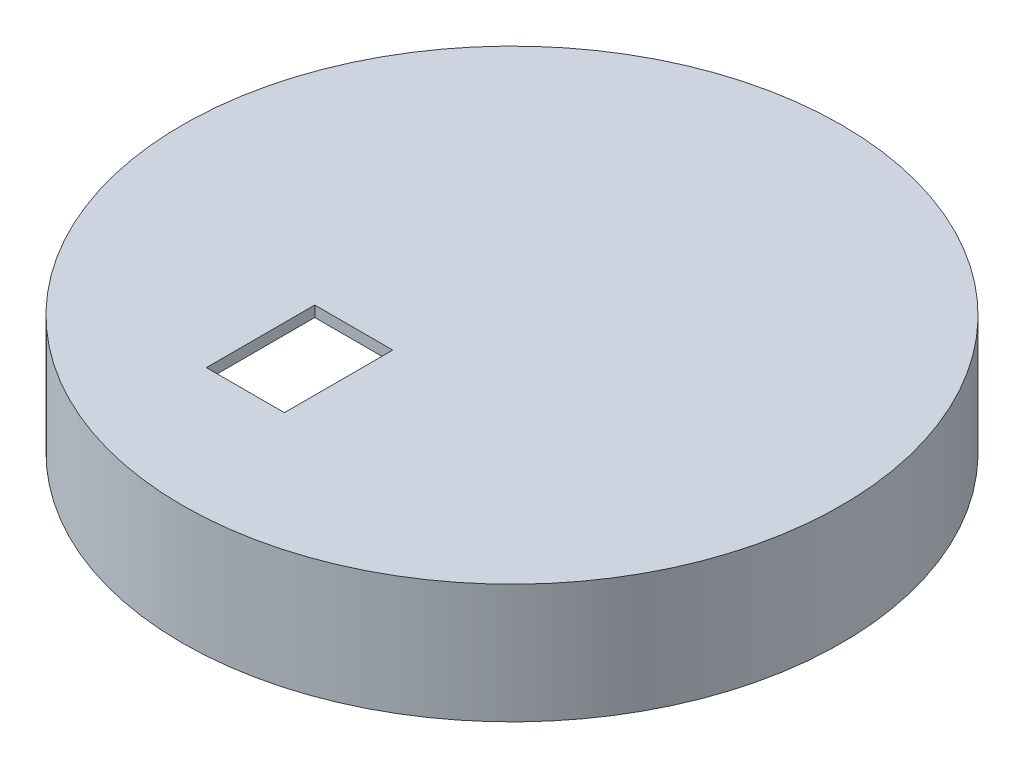
ISO-10303-21;
HEADER;
FILE_DESCRIPTION(('STEP AP214'),'2;1');
FILE_NAME('part.step','',(''),(''),'','','');
FILE_SCHEMA(('AUTOMOTIVE_DESIGN { 1 0 10303 214 1 1 1 1 }'));
ENDSEC;
DATA;
#1=APPLICATION_CONTEXT('core data for automotive mechanical design processes');
#2=APPLICATION_PROTOCOL_DEFINITION('international standard','automotive_design',2000,#1);
#3=PRODUCT_CONTEXT('',#1,'mechanical');
#4=PRODUCT('Part','Part','',(#3));
#5=PRODUCT_RELATED_PRODUCT_CATEGORY('part','',(#4));
#6=PRODUCT_DEFINITION_FORMATION('','',#4);
#7=PRODUCT_DEFINITION_CONTEXT('part definition',#1,'design');
#8=PRODUCT_DEFINITION('design','',#6,#7);
#9=PRODUCT_DEFINITION_SHAPE('','',#8);
#10=(LENGTH_UNIT() NAMED_UNIT(*) SI_UNIT(.MILLI.,.METRE.));
#11=(NAMED_UNIT(*) PLANE_ANGLE_UNIT() SI_UNIT($,.RADIAN.));
#12=(NAMED_UNIT(*) SI_UNIT($,.STERADIAN.) SOLID_ANGLE_UNIT());
#13=UNCERTAINTY_MEASURE_WITH_UNIT(LENGTH_MEASURE(1.E-05),#10,'distance_accuracy_value','');
#14=(GEOMETRIC_REPRESENTATION_CONTEXT(3) GLOBAL_UNCERTAINTY_ASSIGNED_CONTEXT((#13)) GLOBAL_UNIT_ASSIGNED_CONTEXT((#10,
#11,#12)) REPRESENTATION_CONTEXT('',''));
#15=CARTESIAN_POINT('',(0.,0.,0.));
#16=DIRECTION('',(0.,0.,1.));
#17=DIRECTION('',(1.,0.,0.));
#18=AXIS2_PLACEMENT_3D('',#15,#16,#17);
#19=CARTESIAN_POINT('',(0.,0.,0.));
#20=DIRECTION('',(0.,1.,0.));
#21=DIRECTION('',(0.,0.,1.));
#22=AXIS2_PLACEMENT_3D('',#19,#20,#21);
#23=PLANE('',#22);
#24=CARTESIAN_POINT('',(0.,0.,-27.605));
#25=DIRECTION('',(0.,-1.,0.));
#26=DIRECTION('',(-1.,0.,0.));
#27=AXIS2_PLACEMENT_3D('',#24,#25,#26);
#28=CIRCLE('',#27,1.5);
#29=CARTESIAN_POINT('',(-1.5000000000001,0.,-27.605));
#30=VERTEX_POINT('',#29);
#31=EDGE_CURVE('E338',#30,#30,#28,.T.);
#32=ORIENTED_EDGE('',*,*,#31,.F.);
#33=EDGE_LOOP('',(#32));
#34=FACE_BOUND('',#33,.T.);
#35=CARTESIAN_POINT('',(27.605,0.,0.));
#36=DIRECTION('',(0.,-1.,0.));
#37=DIRECTION('',(0.,0.,-1.));
#38=AXIS2_PLACEMENT_3D('',#35,#36,#37);
#39=CIRCLE('',#38,1.5);
#40=CARTESIAN_POINT('',(27.605,0.,-1.5));
#41=VERTEX_POINT('',#40);
#42=EDGE_CURVE('E209',#41,#41,#39,.T.);
#43=ORIENTED_EDGE('',*,*,#42,.F.);
#44=EDGE_LOOP('',(#43));
#45=FACE_BOUND('',#44,.T.);
#46=CARTESIAN_POINT('',(-27.605,0.,0.));
#47=DIRECTION('',(0.,-1.,0.));
#48=DIRECTION('',(0.,0.,-1.));
#49=AXIS2_PLACEMENT_3D('',#46,#47,#48);
#50=CIRCLE('',#49,1.5);
#51=CARTESIAN_POINT('',(-27.605,0.,-1.5));
#52=VERTEX_POINT('',#51);
#53=EDGE_CURVE('E213',#52,#52,#50,.F.);
#54=ORIENTED_EDGE('',*,*,#53,.T.);
#55=EDGE_LOOP('',(#54));
#56=FACE_BOUND('',#55,.T.);
#57=CARTESIAN_POINT('',(0.,0.,0.));
#58=DIRECTION('',(0.,1.,0.));
#59=DIRECTION('',(0.,0.,1.));
#60=AXIS2_PLACEMENT_3D('',#57,#58,#59);
#61=CIRCLE('',#60,30.405);
#62=CARTESIAN_POINT('',(0.,0.,30.405));
#63=VERTEX_POINT('',#62);
#64=EDGE_CURVE('E11',#63,#63,#61,.T.);
#65=ORIENTED_EDGE('',*,*,#64,.F.);
#66=EDGE_LOOP('',(#65));
#67=FACE_BOUND('',#66,.T.);
#68=CARTESIAN_POINT('',(0.,0.,0.));
#69=DIRECTION('',(0.,1.,0.));
#70=DIRECTION('',(0.,0.,1.));
#71=AXIS2_PLACEMENT_3D('',#68,#69,#70);
#72=CIRCLE('',#71,28.405);
#73=CARTESIAN_POINT('',(-28.1267895308821,0.,3.96582093461893));
#74=VERTEX_POINT('',#73);
#75=CARTESIAN_POINT('',(-3.96582093461883,0.,28.1267895308821));
#76=VERTEX_POINT('',#75);
#77=EDGE_CURVE('E42',#74,#76,#72,.T.);
#78=ORIENTED_EDGE('',*,*,#77,.T.);
#79=CARTESIAN_POINT('',(0.,0.,27.605));
#80=DIRECTION('',(0.,1.,0.));
#81=DIRECTION('',(0.,0.,1.));
#82=AXIS2_PLACEMENT_3D('',#79,#80,#81);
#83=CIRCLE('',#82,4.);
#84=CARTESIAN_POINT('',(3.96582093461903,0.,28.1267895308821));
#85=VERTEX_POINT('',#84);
#86=EDGE_CURVE('E163',#76,#85,#83,.F.);
#87=ORIENTED_EDGE('',*,*,#86,.T.);
#88=CARTESIAN_POINT('',(28.1267895308821,0.,3.96582093461894));
#89=VERTEX_POINT('',#88);
#90=EDGE_CURVE('E156',#85,#89,#72,.T.);
#91=ORIENTED_EDGE('',*,*,#90,.T.);
#92=CARTESIAN_POINT('',(27.605,0.,0.));
#93=DIRECTION('',(0.,1.,0.));
#94=DIRECTION('',(0.,0.,1.));
#95=AXIS2_PLACEMENT_3D('',#92,#93,#94);
#96=CIRCLE('',#95,4.);
#97=CARTESIAN_POINT('',(28.1267895308821,0.,-3.96582093461894));
#98=VERTEX_POINT('',#97);
#99=EDGE_CURVE('E227',#98,#89,#96,.T.);
#100=ORIENTED_EDGE('',*,*,#99,.F.);
#101=CARTESIAN_POINT('',(3.96582093461883,0.,-28.1267895308821));
#102=VERTEX_POINT('',#101);
#103=EDGE_CURVE('E155',#98,#102,#72,.T.);
#104=ORIENTED_EDGE('',*,*,#103,.T.);
#105=CARTESIAN_POINT('',(0.,0.,-27.605));
#106=DIRECTION('',(0.,1.,0.));
#107=DIRECTION('',(0.,0.,1.));
#108=AXIS2_PLACEMENT_3D('',#105,#106,#107);
#109=CIRCLE('',#108,4.);
#110=CARTESIAN_POINT('',(-3.96582093461904,0.,-28.1267895308821));
#111=VERTEX_POINT('',#110);
#112=EDGE_CURVE('E125',#111,#102,#109,.T.);
#113=ORIENTED_EDGE('',*,*,#112,.F.);
#114=CARTESIAN_POINT('',(-28.1267895308821,0.,-3.96582093461893));
#115=VERTEX_POINT('',#114);
#116=EDGE_CURVE('E150',#111,#115,#72,.T.);
#117=ORIENTED_EDGE('',*,*,#116,.T.);
#118=CARTESIAN_POINT('',(-27.605,0.,0.));
#119=DIRECTION('',(0.,1.,0.));
#120=DIRECTION('',(0.,0.,1.));
#121=AXIS2_PLACEMENT_3D('',#118,#119,#120);
#122=CIRCLE('',#121,4.);
#123=EDGE_CURVE('E165',#115,#74,#122,.F.);
#124=ORIENTED_EDGE('',*,*,#123,.T.);
#125=EDGE_LOOP('',(#78,#87,#91,#100,#104,#113,#117,#124));
#126=FACE_BOUND('',#125,.T.);
#127=CARTESIAN_POINT('',(0.,0.,27.605));
#128=DIRECTION('',(0.,-1.,0.));
#129=DIRECTION('',(-1.,0.,0.));
#130=AXIS2_PLACEMENT_3D('',#127,#128,#129);
#131=CIRCLE('',#130,1.5);
#132=CARTESIAN_POINT('',(-1.4999999999999,0.,27.605));
#133=VERTEX_POINT('',#132);
#134=EDGE_CURVE('E330',#133,#133,#131,.F.);
#135=ORIENTED_EDGE('',*,*,#134,.T.);
#136=EDGE_LOOP('',(#135));
#137=FACE_BOUND('',#136,.T.);
#138=ADVANCED_FACE('F34',(#34,#45,#56,#67,#126,#137),#23,.F.);
#139=CARTESIAN_POINT('',(0.,10.,0.));
#140=DIRECTION('',(0.,-1.,0.));
#141=DIRECTION('',(0.,0.,-1.));
#142=AXIS2_PLACEMENT_3D('',#139,#140,#141);
#143=CYLINDRICAL_SURFACE('',#142,28.405);
#144=CARTESIAN_POINT('',(0.,10.,0.));
#145=DIRECTION('',(0.,1.,0.));
#146=DIRECTION('',(0.,0.,1.));
#147=AXIS2_PLACEMENT_3D('',#144,#145,#146);
#148=CIRCLE('',#147,28.405);
#149=CARTESIAN_POINT('',(28.1267895308821,10.,-3.96582093461893));
#150=VERTEX_POINT('',#149);
#151=CARTESIAN_POINT('',(3.96582093461883,10.,-28.1267895308821));
#152=VERTEX_POINT('',#151);
#153=EDGE_CURVE('E134',#150,#152,#148,.T.);
#154=ORIENTED_EDGE('',*,*,#153,.T.);
#155=DIRECTION('',(0.,1.,0.));
#156=VECTOR('',#155,1.);
#157=CARTESIAN_POINT('',(3.96582093461883,-9.32952303175249,-28.1267895308821));
#158=LINE('',#157,#156);
#159=EDGE_CURVE('E121',#102,#152,#158,.T.);
#160=ORIENTED_EDGE('',*,*,#159,.F.);
#161=ORIENTED_EDGE('',*,*,#103,.F.);
#162=DIRECTION('',(0.,1.,0.));
#163=VECTOR('',#162,1.);
#164=CARTESIAN_POINT('',(28.1267895308821,-9.32952303175249,-3.96582093461893));
#165=LINE('',#164,#163);
#166=EDGE_CURVE('E142',#98,#150,#165,.T.);
#167=ORIENTED_EDGE('',*,*,#166,.T.);
#168=EDGE_LOOP('',(#154,#160,#161,#167));
#169=FACE_BOUND('',#168,.T.);
#170=ADVANCED_FACE('F140',(#169),#143,.F.);
#171=ORIENTED_EDGE('',*,*,#116,.F.);
#172=DIRECTION('',(0.,1.,0.));
#173=VECTOR('',#172,1.);
#174=CARTESIAN_POINT('',(-3.96582093461903,-9.32952303175249,-28.1267895308821));
#175=LINE('',#174,#173);
#176=CARTESIAN_POINT('',(-3.96582093461903,10.,-28.1267895308821));
#177=VERTEX_POINT('',#176);
#178=EDGE_CURVE('E49',#111,#177,#175,.T.);
#179=ORIENTED_EDGE('',*,*,#178,.T.);
#180=CARTESIAN_POINT('',(-28.1267895308821,10.,-3.96582093461893));
#181=VERTEX_POINT('',#180);
#182=EDGE_CURVE('E137',#177,#181,#148,.T.);
#183=ORIENTED_EDGE('',*,*,#182,.T.);
#184=DIRECTION('',(0.,1.,0.));
#185=VECTOR('',#184,1.);
#186=CARTESIAN_POINT('',(-28.1267895308821,-9.32952303175249,-3.96582093461893));
#187=LINE('',#186,#185);
#188=EDGE_CURVE('E233',#115,#181,#187,.T.);
#189=ORIENTED_EDGE('',*,*,#188,.F.);
#190=EDGE_LOOP('',(#171,#179,#183,#189));
#191=FACE_BOUND('',#190,.T.);
#192=ADVANCED_FACE('F261',(#191),#143,.F.);
#193=CARTESIAN_POINT('',(0.,10.,0.));
#194=DIRECTION('',(0.,1.,0.));
#195=DIRECTION('',(0.,0.,1.));
#196=AXIS2_PLACEMENT_3D('',#193,#194,#195);
#197=PLANE('',#196);
#198=DIRECTION('',(1.,0.,0.));
#199=VECTOR('',#198,1.);
#200=CARTESIAN_POINT('',(0.,10.,18.288570200775));
#201=LINE('',#200,#199);
#202=CARTESIAN_POINT('',(-9.90805745112184,10.,18.288570200775));
#203=VERTEX_POINT('',#202);
#204=CARTESIAN_POINT('',(-2.70805745112184,10.,18.288570200775));
#205=VERTEX_POINT('',#204);
#206=EDGE_CURVE('E203',#203,#205,#201,.T.);
#207=ORIENTED_EDGE('',*,*,#206,.T.);
#208=DIRECTION('',(0.,0.,-1.));
#209=VECTOR('',#208,1.);
#210=CARTESIAN_POINT('',(-2.70805745112184,10.,0.));
#211=LINE('',#210,#209);
#212=CARTESIAN_POINT('',(-2.70805745112184,10.,8.28857020077501));
#213=VERTEX_POINT('',#212);
#214=EDGE_CURVE('E206',#205,#213,#211,.T.);
#215=ORIENTED_EDGE('',*,*,#214,.T.);
#216=DIRECTION('',(-1.,0.,0.));
#217=VECTOR('',#216,1.);
#218=CARTESIAN_POINT('',(0.,10.,8.28857020077501));
#219=LINE('',#218,#217);
#220=CARTESIAN_POINT('',(-9.90805745112184,10.,8.28857020077501));
#221=VERTEX_POINT('',#220);
#222=EDGE_CURVE('E191',#213,#221,#219,.T.);
#223=ORIENTED_EDGE('',*,*,#222,.T.);
#224=DIRECTION('',(0.,0.,1.));
#225=VECTOR('',#224,1.);
#226=CARTESIAN_POINT('',(-9.90805745112184,10.,0.));
#227=LINE('',#226,#225);
#228=EDGE_CURVE('E200',#221,#203,#227,.T.);
#229=ORIENTED_EDGE('',*,*,#228,.T.);
#230=EDGE_LOOP('',(#207,#215,#223,#229));
#231=FACE_BOUND('',#230,.T.);
#232=CARTESIAN_POINT('',(0.,10.,-27.605));
#233=DIRECTION('',(0.,-1.,0.));
#234=DIRECTION('',(-1.,0.,0.));
#235=AXIS2_PLACEMENT_3D('',#232,#233,#234);
#236=CIRCLE('',#235,4.);
#237=EDGE_CURVE('E124',#152,#177,#236,.T.);
#238=ORIENTED_EDGE('',*,*,#237,.F.);
#239=ORIENTED_EDGE('',*,*,#153,.F.);
#240=CARTESIAN_POINT('',(27.605,10.,0.));
#241=DIRECTION('',(0.,-1.,0.));
#242=DIRECTION('',(0.,0.,-1.));
#243=AXIS2_PLACEMENT_3D('',#240,#241,#242);
#244=CIRCLE('',#243,4.);
#245=CARTESIAN_POINT('',(28.1267895308821,10.,3.96582093461893));
#246=VERTEX_POINT('',#245);
#247=EDGE_CURVE('E219',#246,#150,#244,.T.);
#248=ORIENTED_EDGE('',*,*,#247,.F.);
#249=CARTESIAN_POINT('',(3.96582093461903,10.,28.1267895308821));
#250=VERTEX_POINT('',#249);
#251=EDGE_CURVE('E144',#250,#246,#148,.T.);
#252=ORIENTED_EDGE('',*,*,#251,.F.);
#253=CARTESIAN_POINT('',(0.,10.,27.605));
#254=DIRECTION('',(0.,-1.,0.));
#255=DIRECTION('',(-1.,0.,0.));
#256=AXIS2_PLACEMENT_3D('',#253,#254,#255);
#257=CIRCLE('',#256,4.);
#258=CARTESIAN_POINT('',(-3.96582093461883,10.,28.1267895308821));
#259=VERTEX_POINT('',#258);
#260=EDGE_CURVE('E171',#250,#259,#257,.F.);
#261=ORIENTED_EDGE('',*,*,#260,.T.);
#262=CARTESIAN_POINT('',(-28.1267895308821,10.,3.96582093461893));
#263=VERTEX_POINT('',#262);
#264=EDGE_CURVE('E146',#263,#259,#148,.T.);
#265=ORIENTED_EDGE('',*,*,#264,.F.);
#266=CARTESIAN_POINT('',(-27.605,10.,0.));
#267=DIRECTION('',(0.,-1.,0.));
#268=DIRECTION('',(0.,0.,-1.));
#269=AXIS2_PLACEMENT_3D('',#266,#267,#268);
#270=CIRCLE('',#269,4.);
#271=EDGE_CURVE('E230',#263,#181,#270,.F.);
#272=ORIENTED_EDGE('',*,*,#271,.T.);
#273=ORIENTED_EDGE('',*,*,#182,.F.);
#274=EDGE_LOOP('',(#238,#239,#248,#252,#261,#265,#272,#273));
#275=FACE_BOUND('',#274,.T.);
#276=ADVANCED_FACE('F132',(#231,#275),#197,.F.);
#277=DIRECTION('',(0.,1.,0.));
#278=VECTOR('',#277,1.);
#279=CARTESIAN_POINT('',(-3.96582093461883,-9.32952303175249,28.1267895308821));
#280=LINE('',#279,#278);
#281=EDGE_CURVE('E169',#76,#259,#280,.T.);
#282=ORIENTED_EDGE('',*,*,#281,.F.);
#283=ORIENTED_EDGE('',*,*,#77,.F.);
#284=DIRECTION('',(0.,1.,0.));
#285=VECTOR('',#284,1.);
#286=CARTESIAN_POINT('',(-28.1267895308821,-9.32952303175249,3.96582093461893));
#287=LINE('',#286,#285);
#288=EDGE_CURVE('E168',#74,#263,#287,.T.);
#289=ORIENTED_EDGE('',*,*,#288,.T.);
#290=ORIENTED_EDGE('',*,*,#264,.T.);
#291=EDGE_LOOP('',(#282,#283,#289,#290));
#292=FACE_BOUND('',#291,.T.);
#293=ADVANCED_FACE('F167',(#292),#143,.F.);
#294=DIRECTION('',(0.,1.,0.));
#295=VECTOR('',#294,1.);
#296=CARTESIAN_POINT('',(3.96582093461903,-9.32952303175249,28.1267895308821));
#297=LINE('',#296,#295);
#298=EDGE_CURVE('E57',#85,#250,#297,.T.);
#299=ORIENTED_EDGE('',*,*,#298,.T.);
#300=ORIENTED_EDGE('',*,*,#251,.T.);
#301=DIRECTION('',(0.,1.,0.));
#302=VECTOR('',#301,1.);
#303=CARTESIAN_POINT('',(28.1267895308821,-9.32952303175249,3.96582093461893));
#304=LINE('',#303,#302);
#305=EDGE_CURVE('E224',#89,#246,#304,.T.);
#306=ORIENTED_EDGE('',*,*,#305,.F.);
#307=ORIENTED_EDGE('',*,*,#90,.F.);
#308=EDGE_LOOP('',(#299,#300,#306,#307));
#309=FACE_BOUND('',#308,.T.);
#310=ADVANCED_FACE('F242',(#309),#143,.F.);
#311=CARTESIAN_POINT('',(0.,10.,0.));
#312=DIRECTION('',(0.,-1.,0.));
#313=DIRECTION('',(0.,0.,-1.));
#314=AXIS2_PLACEMENT_3D('',#311,#312,#313);
#315=CYLINDRICAL_SURFACE('',#314,30.405);
#316=ORIENTED_EDGE('',*,*,#64,.T.);
#317=EDGE_LOOP('',(#316));
#318=FACE_BOUND('',#317,.T.);
#319=CARTESIAN_POINT('',(0.,11.,0.));
#320=DIRECTION('',(0.,1.,0.));
#321=DIRECTION('',(0.,0.,1.));
#322=AXIS2_PLACEMENT_3D('',#319,#320,#321);
#323=CIRCLE('',#322,30.405);
#324=CARTESIAN_POINT('',(0.,11.,30.405));
#325=VERTEX_POINT('',#324);
#326=EDGE_CURVE('E147',#325,#325,#323,.T.);
#327=ORIENTED_EDGE('',*,*,#326,.F.);
#328=EDGE_LOOP('',(#327));
#329=FACE_BOUND('',#328,.T.);
#330=ADVANCED_FACE('F36',(#318,#329),#315,.T.);
#331=CARTESIAN_POINT('',(0.,11.,0.));
#332=DIRECTION('',(0.,1.,0.));
#333=DIRECTION('',(0.,0.,1.));
#334=AXIS2_PLACEMENT_3D('',#331,#332,#333);
#335=PLANE('',#334);
#336=DIRECTION('',(0.,0.,-1.));
#337=VECTOR('',#336,1.);
#338=CARTESIAN_POINT('',(-2.70805745112184,11.,18.288570200775));
#339=LINE('',#338,#337);
#340=CARTESIAN_POINT('',(-2.70805745112184,11.,18.288570200775));
#341=VERTEX_POINT('',#340);
#342=CARTESIAN_POINT('',(-2.70805745112184,11.,8.28857020077501));
#343=VERTEX_POINT('',#342);
#344=EDGE_CURVE('E177',#341,#343,#339,.T.);
#345=ORIENTED_EDGE('',*,*,#344,.F.);
#346=DIRECTION('',(1.,0.,0.));
#347=VECTOR('',#346,1.);
#348=CARTESIAN_POINT('',(-9.90805745112184,11.,18.288570200775));
#349=LINE('',#348,#347);
#350=CARTESIAN_POINT('',(-9.90805745112184,11.,18.288570200775));
#351=VERTEX_POINT('',#350);
#352=EDGE_CURVE('E185',#351,#341,#349,.T.);
#353=ORIENTED_EDGE('',*,*,#352,.F.);
#354=DIRECTION('',(0.,0.,1.));
#355=VECTOR('',#354,1.);
#356=CARTESIAN_POINT('',(-9.90805745112184,11.,18.288570200775));
#357=LINE('',#356,#355);
#358=CARTESIAN_POINT('',(-9.90805745112184,11.,8.28857020077501));
#359=VERTEX_POINT('',#358);
#360=EDGE_CURVE('E182',#359,#351,#357,.T.);
#361=ORIENTED_EDGE('',*,*,#360,.F.);
#362=DIRECTION('',(-1.,0.,0.));
#363=VECTOR('',#362,1.);
#364=CARTESIAN_POINT('',(-9.90805745112184,11.,8.28857020077501));
#365=LINE('',#364,#363);
#366=EDGE_CURVE('E179',#343,#359,#365,.T.);
#367=ORIENTED_EDGE('',*,*,#366,.F.);
#368=EDGE_LOOP('',(#345,#353,#361,#367));
#369=FACE_BOUND('',#368,.T.);
#370=ORIENTED_EDGE('',*,*,#326,.T.);
#371=EDGE_LOOP('',(#370));
#372=FACE_BOUND('',#371,.T.);
#373=ADVANCED_FACE('F239',(#369,#372),#335,.T.);
#374=CARTESIAN_POINT('',(-27.605,-9.32952303175249,0.));
#375=DIRECTION('',(0.,1.,0.));
#376=DIRECTION('',(0.,0.,1.));
#377=AXIS2_PLACEMENT_3D('',#374,#375,#376);
#378=CYLINDRICAL_SURFACE('',#377,4.);
#379=ORIENTED_EDGE('',*,*,#123,.F.);
#380=ORIENTED_EDGE('',*,*,#188,.T.);
#381=ORIENTED_EDGE('',*,*,#271,.F.);
#382=ORIENTED_EDGE('',*,*,#288,.F.);
#383=EDGE_LOOP('',(#379,#380,#381,#382));
#384=FACE_BOUND('',#383,.T.);
#385=ADVANCED_FACE('F248',(#384),#378,.T.);
#386=CARTESIAN_POINT('',(27.605,-9.32952303175249,0.));
#387=DIRECTION('',(0.,1.,0.));
#388=DIRECTION('',(0.,0.,1.));
#389=AXIS2_PLACEMENT_3D('',#386,#387,#388);
#390=CYLINDRICAL_SURFACE('',#389,4.);
#391=ORIENTED_EDGE('',*,*,#166,.F.);
#392=ORIENTED_EDGE('',*,*,#99,.T.);
#393=ORIENTED_EDGE('',*,*,#305,.T.);
#394=ORIENTED_EDGE('',*,*,#247,.T.);
#395=EDGE_LOOP('',(#391,#392,#393,#394));
#396=FACE_BOUND('',#395,.T.);
#397=ADVANCED_FACE('F270',(#396),#390,.T.);
#398=CARTESIAN_POINT('',(-27.605,10.,0.));
#399=DIRECTION('',(0.,-1.,0.));
#400=DIRECTION('',(0.,0.,-1.));
#401=AXIS2_PLACEMENT_3D('',#398,#399,#400);
#402=CYLINDRICAL_SURFACE('',#401,1.5);
#403=CARTESIAN_POINT('',(-27.605,10.,0.));
#404=DIRECTION('',(0.,-1.,0.));
#405=DIRECTION('',(0.,0.,-1.));
#406=AXIS2_PLACEMENT_3D('',#403,#404,#405);
#407=CIRCLE('',#406,1.5);
#408=CARTESIAN_POINT('',(-27.605,10.,-1.5));
#409=VERTEX_POINT('',#408);
#410=EDGE_CURVE('E216',#409,#409,#407,.F.);
#411=ORIENTED_EDGE('',*,*,#410,.T.);
#412=EDGE_LOOP('',(#411));
#413=FACE_BOUND('',#412,.T.);
#414=ORIENTED_EDGE('',*,*,#53,.F.);
#415=EDGE_LOOP('',(#414));
#416=FACE_BOUND('',#415,.T.);
#417=ADVANCED_FACE('F274',(#413,#416),#402,.F.);
#418=CARTESIAN_POINT('',(0.,10.,0.));
#419=DIRECTION('',(0.,-1.,0.));
#420=DIRECTION('',(0.,0.,-1.));
#421=AXIS2_PLACEMENT_3D('',#418,#419,#420);
#422=PLANE('',#421);
#423=ORIENTED_EDGE('',*,*,#410,.F.);
#424=EDGE_LOOP('',(#423));
#425=FACE_BOUND('',#424,.T.);
#426=ADVANCED_FACE('F278',(#425),#422,.T.);
#427=CARTESIAN_POINT('',(27.605,10.,0.));
#428=DIRECTION('',(0.,-1.,0.));
#429=DIRECTION('',(0.,0.,-1.));
#430=AXIS2_PLACEMENT_3D('',#427,#428,#429);
#431=CYLINDRICAL_SURFACE('',#430,1.5);
#432=CARTESIAN_POINT('',(27.605,10.,0.));
#433=DIRECTION('',(0.,-1.,0.));
#434=DIRECTION('',(0.,0.,-1.));
#435=AXIS2_PLACEMENT_3D('',#432,#433,#434);
#436=CIRCLE('',#435,1.5);
#437=CARTESIAN_POINT('',(27.605,10.,-1.5));
#438=VERTEX_POINT('',#437);
#439=EDGE_CURVE('E210',#438,#438,#436,.T.);
#440=ORIENTED_EDGE('',*,*,#439,.F.);
#441=EDGE_LOOP('',(#440));
#442=FACE_BOUND('',#441,.T.);
#443=ORIENTED_EDGE('',*,*,#42,.T.);
#444=EDGE_LOOP('',(#443));
#445=FACE_BOUND('',#444,.T.);
#446=ADVANCED_FACE('F282',(#442,#445),#431,.F.);
#447=CARTESIAN_POINT('',(0.,10.,0.));
#448=DIRECTION('',(0.,-1.,0.));
#449=DIRECTION('',(0.,0.,-1.));
#450=AXIS2_PLACEMENT_3D('',#447,#448,#449);
#451=PLANE('',#450);
#452=ORIENTED_EDGE('',*,*,#439,.T.);
#453=EDGE_LOOP('',(#452));
#454=FACE_BOUND('',#453,.T.);
#455=ADVANCED_FACE('F286',(#454),#451,.T.);
#456=CARTESIAN_POINT('',(-2.70805745112184,0.999999999999999,18.288570200775));
#457=DIRECTION('',(1.,0.,0.));
#458=DIRECTION('',(0.,0.,-1.));
#459=AXIS2_PLACEMENT_3D('',#456,#457,#458);
#460=PLANE('',#459);
#461=DIRECTION('',(0.,1.,0.));
#462=VECTOR('',#461,1.);
#463=CARTESIAN_POINT('',(-2.70805745112184,0.999999999999999,18.288570200775));
#464=LINE('',#463,#462);
#465=EDGE_CURVE('E189',#205,#341,#464,.T.);
#466=ORIENTED_EDGE('',*,*,#465,.T.);
#467=ORIENTED_EDGE('',*,*,#344,.T.);
#468=DIRECTION('',(0.,1.,0.));
#469=VECTOR('',#468,1.);
#470=CARTESIAN_POINT('',(-2.70805745112184,0.999999999999999,8.28857020077501));
#471=LINE('',#470,#469);
#472=EDGE_CURVE('E188',#213,#343,#471,.T.);
#473=ORIENTED_EDGE('',*,*,#472,.F.);
#474=ORIENTED_EDGE('',*,*,#214,.F.);
#475=EDGE_LOOP('',(#466,#467,#473,#474));
#476=FACE_BOUND('',#475,.T.);
#477=ADVANCED_FACE('F290',(#476),#460,.F.);
#478=CARTESIAN_POINT('',(-9.90805745112184,0.999999999999999,18.288570200775));
#479=DIRECTION('',(0.,0.,1.));
#480=DIRECTION('',(1.,0.,0.));
#481=AXIS2_PLACEMENT_3D('',#478,#479,#480);
#482=PLANE('',#481);
#483=DIRECTION('',(0.,1.,0.));
#484=VECTOR('',#483,1.);
#485=CARTESIAN_POINT('',(-9.90805745112184,0.999999999999999,18.288570200775));
#486=LINE('',#485,#484);
#487=EDGE_CURVE('E192',#203,#351,#486,.T.);
#488=ORIENTED_EDGE('',*,*,#487,.T.);
#489=ORIENTED_EDGE('',*,*,#352,.T.);
#490=ORIENTED_EDGE('',*,*,#465,.F.);
#491=ORIENTED_EDGE('',*,*,#206,.F.);
#492=EDGE_LOOP('',(#488,#489,#490,#491));
#493=FACE_BOUND('',#492,.T.);
#494=ADVANCED_FACE('F294',(#493),#482,.F.);
#495=CARTESIAN_POINT('',(-9.90805745112184,0.999999999999999,18.288570200775));
#496=DIRECTION('',(-1.,0.,0.));
#497=DIRECTION('',(0.,0.,1.));
#498=AXIS2_PLACEMENT_3D('',#495,#496,#497);
#499=PLANE('',#498);
#500=DIRECTION('',(0.,1.,0.));
#501=VECTOR('',#500,1.);
#502=CARTESIAN_POINT('',(-9.90805745112184,0.999999999999999,8.28857020077501));
#503=LINE('',#502,#501);
#504=EDGE_CURVE('E194',#221,#359,#503,.T.);
#505=ORIENTED_EDGE('',*,*,#504,.T.);
#506=ORIENTED_EDGE('',*,*,#360,.T.);
#507=ORIENTED_EDGE('',*,*,#487,.F.);
#508=ORIENTED_EDGE('',*,*,#228,.F.);
#509=EDGE_LOOP('',(#505,#506,#507,#508));
#510=FACE_BOUND('',#509,.T.);
#511=ADVANCED_FACE('F300',(#510),#499,.F.);
#512=CARTESIAN_POINT('',(-9.90805745112184,0.999999999999999,8.28857020077501));
#513=DIRECTION('',(0.,0.,-1.));
#514=DIRECTION('',(-1.,0.,0.));
#515=AXIS2_PLACEMENT_3D('',#512,#513,#514);
#516=PLANE('',#515);
#517=ORIENTED_EDGE('',*,*,#472,.T.);
#518=ORIENTED_EDGE('',*,*,#366,.T.);
#519=ORIENTED_EDGE('',*,*,#504,.F.);
#520=ORIENTED_EDGE('',*,*,#222,.F.);
#521=EDGE_LOOP('',(#517,#518,#519,#520));
#522=FACE_BOUND('',#521,.T.);
#523=ADVANCED_FACE('F296',(#522),#516,.F.);
#524=CARTESIAN_POINT('',(0.,-9.32952303175249,27.605));
#525=DIRECTION('',(0.,1.,0.));
#526=DIRECTION('',(0.,0.,1.));
#527=AXIS2_PLACEMENT_3D('',#524,#525,#526);
#528=CYLINDRICAL_SURFACE('',#527,4.);
#529=ORIENTED_EDGE('',*,*,#86,.F.);
#530=ORIENTED_EDGE('',*,*,#281,.T.);
#531=ORIENTED_EDGE('',*,*,#260,.F.);
#532=ORIENTED_EDGE('',*,*,#298,.F.);
#533=EDGE_LOOP('',(#529,#530,#531,#532));
#534=FACE_BOUND('',#533,.T.);
#535=ADVANCED_FACE('F299',(#534),#528,.T.);
#536=CARTESIAN_POINT('',(0.,-9.32952303175249,-27.605));
#537=DIRECTION('',(0.,1.,0.));
#538=DIRECTION('',(0.,0.,1.));
#539=AXIS2_PLACEMENT_3D('',#536,#537,#538);
#540=CYLINDRICAL_SURFACE('',#539,4.);
#541=ORIENTED_EDGE('',*,*,#178,.F.);
#542=ORIENTED_EDGE('',*,*,#112,.T.);
#543=ORIENTED_EDGE('',*,*,#159,.T.);
#544=ORIENTED_EDGE('',*,*,#237,.T.);
#545=EDGE_LOOP('',(#541,#542,#543,#544));
#546=FACE_BOUND('',#545,.T.);
#547=ADVANCED_FACE('F123',(#546),#540,.T.);
#548=CARTESIAN_POINT('',(0.,10.,-27.605));
#549=DIRECTION('',(0.,-1.,0.));
#550=DIRECTION('',(0.,0.,-1.));
#551=AXIS2_PLACEMENT_3D('',#548,#549,#550);
#552=CYLINDRICAL_SURFACE('',#551,1.5);
#553=CARTESIAN_POINT('',(0.,10.,-27.605));
#554=DIRECTION('',(0.,-1.,0.));
#555=DIRECTION('',(-1.,0.,0.));
#556=AXIS2_PLACEMENT_3D('',#553,#554,#555);
#557=CIRCLE('',#556,1.5);
#558=CARTESIAN_POINT('',(-1.5000000000001,10.,-27.605));
#559=VERTEX_POINT('',#558);
#560=EDGE_CURVE('E333',#559,#559,#557,.T.);
#561=ORIENTED_EDGE('',*,*,#560,.F.);
#562=EDGE_LOOP('',(#561));
#563=FACE_BOUND('',#562,.T.);
#564=ORIENTED_EDGE('',*,*,#31,.T.);
#565=EDGE_LOOP('',(#564));
#566=FACE_BOUND('',#565,.T.);
#567=ADVANCED_FACE('F311',(#563,#566),#552,.F.);
#568=CARTESIAN_POINT('',(0.,10.,0.));
#569=DIRECTION('',(0.,-1.,0.));
#570=DIRECTION('',(-1.,0.,0.));
#571=AXIS2_PLACEMENT_3D('',#568,#569,#570);
#572=PLANE('',#571);
#573=ORIENTED_EDGE('',*,*,#560,.T.);
#574=EDGE_LOOP('',(#573));
#575=FACE_BOUND('',#574,.T.);
#576=ADVANCED_FACE('F314',(#575),#572,.T.);
#577=CARTESIAN_POINT('',(0.,10.,27.605));
#578=DIRECTION('',(0.,-1.,0.));
#579=DIRECTION('',(0.,0.,-1.));
#580=AXIS2_PLACEMENT_3D('',#577,#578,#579);
#581=CYLINDRICAL_SURFACE('',#580,1.5);
#582=CARTESIAN_POINT('',(0.,10.,27.605));
#583=DIRECTION('',(0.,-1.,0.));
#584=DIRECTION('',(-1.,0.,0.));
#585=AXIS2_PLACEMENT_3D('',#582,#583,#584);
#586=CIRCLE('',#585,1.5);
#587=CARTESIAN_POINT('',(-1.4999999999999,10.,27.605));
#588=VERTEX_POINT('',#587);
#589=EDGE_CURVE('E138',#588,#588,#586,.F.);
#590=ORIENTED_EDGE('',*,*,#589,.T.);
#591=EDGE_LOOP('',(#590));
#592=FACE_BOUND('',#591,.T.);
#593=ORIENTED_EDGE('',*,*,#134,.F.);
#594=EDGE_LOOP('',(#593));
#595=FACE_BOUND('',#594,.T.);
#596=ADVANCED_FACE('F318',(#592,#595),#581,.F.);
#597=CARTESIAN_POINT('',(0.,10.,0.));
#598=DIRECTION('',(0.,-1.,0.));
#599=DIRECTION('',(-1.,0.,0.));
#600=AXIS2_PLACEMENT_3D('',#597,#598,#599);
#601=PLANE('',#600);
#602=ORIENTED_EDGE('',*,*,#589,.F.);
#603=EDGE_LOOP('',(#602));
#604=FACE_BOUND('',#603,.T.);
#605=ADVANCED_FACE('F322',(#604),#601,.T.);
#606=CLOSED_SHELL('',(#138,#170,#192,#276,#293,#310,#330,#373,#385,#397,#417,#426,#446,#455,
#477,#494,#511,#523,#535,#547,#567,#576,#596,#605));
#607=MANIFOLD_SOLID_BREP('B2',#606);
#608=ADVANCED_BREP_SHAPE_REPRESENTATION('',(#18,#607),#14);
#609=SHAPE_DEFINITION_REPRESENTATION(#9,#608);
ENDSEC;
END-ISO-10303-21;
